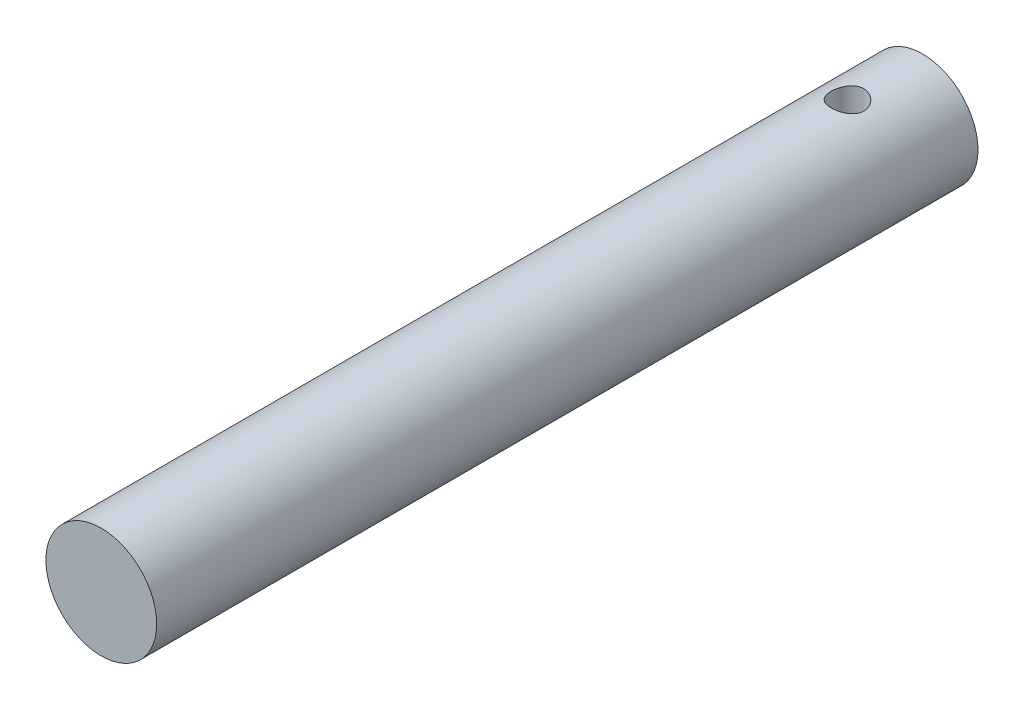
ISO-10303-21;
HEADER;
FILE_DESCRIPTION(('STEP AP214'),'2;1');
FILE_NAME('part.step','',(''),(''),'','','');
FILE_SCHEMA(('AUTOMOTIVE_DESIGN { 1 0 10303 214 1 1 1 1 }'));
ENDSEC;
DATA;
#1=APPLICATION_CONTEXT('core data for automotive mechanical design processes');
#2=APPLICATION_PROTOCOL_DEFINITION('international standard','automotive_design',2000,#1);
#3=PRODUCT_CONTEXT('',#1,'mechanical');
#4=PRODUCT('Part','Part','',(#3));
#5=PRODUCT_RELATED_PRODUCT_CATEGORY('part','',(#4));
#6=PRODUCT_DEFINITION_FORMATION('','',#4);
#7=PRODUCT_DEFINITION_CONTEXT('part definition',#1,'design');
#8=PRODUCT_DEFINITION('design','',#6,#7);
#9=PRODUCT_DEFINITION_SHAPE('','',#8);
#10=(LENGTH_UNIT() NAMED_UNIT(*) SI_UNIT(.MILLI.,.METRE.));
#11=(NAMED_UNIT(*) PLANE_ANGLE_UNIT() SI_UNIT($,.RADIAN.));
#12=(NAMED_UNIT(*) SI_UNIT($,.STERADIAN.) SOLID_ANGLE_UNIT());
#13=UNCERTAINTY_MEASURE_WITH_UNIT(LENGTH_MEASURE(1.E-05),#10,'distance_accuracy_value','');
#14=(GEOMETRIC_REPRESENTATION_CONTEXT(3) GLOBAL_UNCERTAINTY_ASSIGNED_CONTEXT((#13)) GLOBAL_UNIT_ASSIGNED_CONTEXT((#10,
#11,#12)) REPRESENTATION_CONTEXT('',''));
#15=CARTESIAN_POINT('',(0.,0.,0.));
#16=DIRECTION('',(0.,0.,1.));
#17=DIRECTION('',(1.,0.,0.));
#18=AXIS2_PLACEMENT_3D('',#15,#16,#17);
#19=CARTESIAN_POINT('',(0.,0.,89.));
#20=DIRECTION('',(0.,0.,-1.));
#21=DIRECTION('',(-1.,0.,0.));
#22=AXIS2_PLACEMENT_3D('',#19,#20,#21);
#23=CYLINDRICAL_SURFACE('',#22,6.);
#24=CARTESIAN_POINT('',(0.,-6.,6.45193384495039));
#25=CARTESIAN_POINT('',(-0.0981589939703736,-5.99999912553035,6.45722712161039));
#26=CARTESIAN_POINT('',(-0.195893627355128,-5.99756827380598,6.47064279163591));
#27=CARTESIAN_POINT('',(-0.387645070059898,-5.98823510352722,6.51327716783869));
#28=CARTESIAN_POINT('',(-0.481660563095357,-5.98133121662876,6.54250141625607));
#29=CARTESIAN_POINT('',(-0.663203684655316,-5.96393085040532,6.61573788714498));
#30=CARTESIAN_POINT('',(-0.750740805172326,-5.95343975904429,6.65972792965871));
#31=CARTESIAN_POINT('',(-0.917247696642102,-5.9300704277999,6.76120169999923));
#32=CARTESIAN_POINT('',(-0.996216452235155,-5.91719190549231,6.81868702448234));
#33=CARTESIAN_POINT('',(-1.14553470171172,-5.89013234401508,6.94723098003324));
#34=CARTESIAN_POINT('',(-1.21561658435395,-5.87592664644819,7.01859537111143));
#35=CARTESIAN_POINT('',(-1.34298115793278,-5.84813312807984,7.17207420919818));
#36=CARTESIAN_POINT('',(-1.40026234325196,-5.83454538011113,7.25418991897684));
#37=CARTESIAN_POINT('',(-1.50126472754359,-5.80938615993411,7.42850289257588));
#38=CARTESIAN_POINT('',(-1.54475046655802,-5.79785103773004,7.52084229045526));
#39=CARTESIAN_POINT('',(-1.61546455344666,-5.77854913877898,7.711917861516));
#40=CARTESIAN_POINT('',(-1.64269697374356,-5.77078141816537,7.81065242544928));
#41=CARTESIAN_POINT('',(-1.67938521528112,-5.76021030098019,8.00863458745727));
#42=CARTESIAN_POINT('',(-1.68933792088375,-5.7572682829843,8.10778262100481));
#43=CARTESIAN_POINT('',(-1.69263877787352,-5.75629908809258,8.30636973849283));
#44=CARTESIAN_POINT('',(-1.68598962839867,-5.75827111226918,8.4058087724969));
#45=CARTESIAN_POINT('',(-1.65674576935804,-5.76675039420702,8.59933500173528));
#46=CARTESIAN_POINT('',(-1.63458725625977,-5.77313352986367,8.69349420441194));
#47=CARTESIAN_POINT('',(-1.57553278408771,-5.78952746748481,8.87673338119604));
#48=CARTESIAN_POINT('',(-1.53863494635351,-5.79953873187205,8.96581270617245));
#49=CARTESIAN_POINT('',(-1.45031977193343,-5.82225760719022,9.13835462798297));
#50=CARTESIAN_POINT('',(-1.3986273855492,-5.83501503824765,9.22166966729843));
#51=CARTESIAN_POINT('',(-1.28244785155786,-5.86164412456185,9.37865121784254));
#52=CARTESIAN_POINT('',(-1.2179578960557,-5.87551602394419,9.45231560573743));
#53=CARTESIAN_POINT('',(-1.07535094677777,-5.90330989039028,9.59054686675218));
#54=CARTESIAN_POINT('',(-0.996839747755389,-5.91721699139799,9.65471091019525));
#55=CARTESIAN_POINT('',(-0.829867403982079,-5.94293229029509,9.76899176152758));
#56=CARTESIAN_POINT('',(-0.741406595045708,-5.95474055898859,9.81910904331731));
#57=CARTESIAN_POINT('',(-0.5574214882735,-5.97476261442765,9.9035210337451));
#58=CARTESIAN_POINT('',(-0.461937908586405,-5.98299546522705,9.93789971483817));
#59=CARTESIAN_POINT('',(-0.266271069037455,-5.99488880932818,9.99004501251307));
#60=CARTESIAN_POINT('',(-0.166089105699514,-5.9985505564171,10.0078161839567));
#61=CARTESIAN_POINT('',(0.0322232136226922,-6.00070329351695,10.0257900675117));
#62=CARTESIAN_POINT('',(0.130296420844028,-5.99937679321417,10.0266058905755));
#63=CARTESIAN_POINT('',(0.32507403749667,-5.99198000015561,10.012241326523));
#64=CARTESIAN_POINT('',(0.42177852805242,-5.98590998975868,9.99706189151052));
#65=CARTESIAN_POINT('',(0.610037073087875,-5.96964760663314,9.95153187974019));
#66=CARTESIAN_POINT('',(0.701635866449269,-5.95950101284544,9.92134892373637));
#67=CARTESIAN_POINT('',(0.87846248046005,-5.93601449587542,9.8468749606263));
#68=CARTESIAN_POINT('',(0.963689219511545,-5.92267403217051,9.80258156508447));
#69=CARTESIAN_POINT('',(1.12834118951306,-5.89356124457394,9.69950258337219));
#70=CARTESIAN_POINT('',(1.20749205233336,-5.87772455924555,9.64029710641231));
#71=CARTESIAN_POINT('',(1.35493620291722,-5.84549860857085,9.50973941950028));
#72=CARTESIAN_POINT('',(1.42322675789763,-5.82910920539746,9.43838416161805));
#73=CARTESIAN_POINT('',(1.54924306596897,-5.79691452951496,9.28279336678507));
#74=CARTESIAN_POINT('',(1.60655956822582,-5.78114486821064,9.19821803496963));
#75=CARTESIAN_POINT('',(1.70612387367865,-5.75255048129158,9.02015792240114));
#76=CARTESIAN_POINT('',(1.74837382699027,-5.73972533556432,8.92667441532998));
#77=CARTESIAN_POINT('',(1.81576927475437,-5.71875990457277,8.73511021542849));
#78=CARTESIAN_POINT('',(1.84120601752018,-5.71054024476593,8.6371410609498));
#79=CARTESIAN_POINT('',(1.87519024204499,-5.69947285053376,8.43803154192809));
#80=CARTESIAN_POINT('',(1.88374365993022,-5.69662322803542,8.33689230468704));
#81=CARTESIAN_POINT('',(1.88363204774477,-5.6966590407518,8.13923846393843));
#82=CARTESIAN_POINT('',(1.87573135058275,-5.69928989616014,8.04272243425636));
#83=CARTESIAN_POINT('',(1.8445414125327,-5.70945984282266,7.85248422977896));
#84=CARTESIAN_POINT('',(1.82125189075,-5.71699902366925,7.75876210601387));
#85=CARTESIAN_POINT('',(1.76017944291828,-5.73609443024919,7.5769140780013));
#86=CARTESIAN_POINT('',(1.72243659138085,-5.74763954056847,7.48877347849598));
#87=CARTESIAN_POINT('',(1.63359457900836,-5.77351729303228,7.31995050722088));
#88=CARTESIAN_POINT('',(1.58249243858195,-5.78785055685037,7.23926980471155));
#89=CARTESIAN_POINT('',(1.46576307313484,-5.81853321402401,7.08387831611617));
#90=CARTESIAN_POINT('',(1.39959813606673,-5.83494338224661,7.00958320954853));
#91=CARTESIAN_POINT('',(1.2558438007286,-5.86756182461082,6.87293295390057));
#92=CARTESIAN_POINT('',(1.17825155376794,-5.88377004731394,6.8105807909946));
#93=CARTESIAN_POINT('',(1.0113989499108,-5.91476523830952,6.69801742782261));
#94=CARTESIAN_POINT('',(0.921887993527252,-5.92950439178107,6.64816340012943));
#95=CARTESIAN_POINT('',(0.73526619394301,-5.95552148233233,6.56435157611458));
#96=CARTESIAN_POINT('',(0.638159469233721,-5.96680127900106,6.53038523413781));
#97=CARTESIAN_POINT('',(0.451136692492847,-5.98366208943459,6.48260104446463));
#98=CARTESIAN_POINT('',(0.361756675730947,-5.98976463555431,6.46685406177117));
#99=CARTESIAN_POINT('',(0.18146391217883,-5.9979337004167,6.44907994441642));
#100=CARTESIAN_POINT('',(0.0905513904566932,-6.00000080669575,6.44705081241055));
#101=CARTESIAN_POINT('',(0.,-6.,6.45193384495039));
#102=B_SPLINE_CURVE_WITH_KNOTS('',3,(#24,#25,#26,#27,#28,#29,#30,#31,#32,#33,#34,#35,#36,#37,
#38,#39,#40,#41,#42,#43,#44,#45,#46,#47,#48,#49,#50,#51,#52,#53,#54,#55,#56,#57,#58,#59,#60,#61,
#62,#63,#64,#65,#66,#67,#68,#69,#70,#71,#72,#73,#74,#75,#76,#77,#78,#79,#80,#81,#82,#83,#84,#85,
#86,#87,#88,#89,#90,#91,#92,#93,#94,#95,#96,#97,#98,#99,#100,#101),.UNSPECIFIED.,.T.,.F.,(4,2,2,
2,2,2,2,2,2,2,2,2,2,2,2,2,2,2,2,2,2,2,2,2,2,2,2,2,2,2,2,2,2,2,2,2,2,2,4),(0.,0.29457037867354,
0.589244096104816,0.883477145196146,1.17774502320245,1.47943446575808,1.78115937435672,
2.08778700685607,2.39433777861393,2.69191781313658,2.98944947009694,3.27893282515959,
3.5684530892766,3.86375086097786,4.1591134952903,4.46469292186468,4.77026203775913,
5.07418124079912,5.37801706489725,5.67084617977806,5.96365786524615,6.25326936896729,
6.54292992050753,6.84189682809621,7.14093884620666,7.44957518017546,7.75816745165675,
8.06126331058274,8.36425258292072,8.65348162124199,8.94271593905261,9.23115404111098,
9.51965652997898,9.82078250321976,10.1219836710014,10.4310034866538,10.7398568953056,
11.0116367974331,11.2833771270487),.UNSPECIFIED.);
#103=CARTESIAN_POINT('',(0.,-6.,6.45193384495039));
#104=VERTEX_POINT('',#103);
#105=EDGE_CURVE('E55',#104,#104,#102,.T.);
#106=ORIENTED_EDGE('',*,*,#105,.T.);
#107=EDGE_LOOP('',(#106));
#108=FACE_BOUND('',#107,.T.);
#109=CARTESIAN_POINT('',(0.,0.,89.));
#110=DIRECTION('',(0.,0.,1.));
#111=DIRECTION('',(1.,0.,0.));
#112=AXIS2_PLACEMENT_3D('',#109,#110,#111);
#113=CIRCLE('',#112,6.);
#114=CARTESIAN_POINT('',(6.,0.,89.));
#115=VERTEX_POINT('',#114);
#116=EDGE_CURVE('E60',#115,#115,#113,.T.);
#117=ORIENTED_EDGE('',*,*,#116,.F.);
#118=EDGE_LOOP('',(#117));
#119=FACE_BOUND('',#118,.T.);
#120=CARTESIAN_POINT('',(0.,0.,0.));
#121=DIRECTION('',(0.,0.,1.));
#122=DIRECTION('',(1.,0.,0.));
#123=AXIS2_PLACEMENT_3D('',#120,#121,#122);
#124=CIRCLE('',#123,6.);
#125=CARTESIAN_POINT('',(6.,0.,0.));
#126=VERTEX_POINT('',#125);
#127=EDGE_CURVE('E65',#126,#126,#124,.T.);
#128=ORIENTED_EDGE('',*,*,#127,.T.);
#129=EDGE_LOOP('',(#128));
#130=FACE_BOUND('',#129,.T.);
#131=CARTESIAN_POINT('',(0.,6.,6.45193384495039));
#132=CARTESIAN_POINT('',(-0.0981589939703736,5.99999912553035,6.45722712161039));
#133=CARTESIAN_POINT('',(-0.195893627355128,5.99756827380598,6.47064279163591));
#134=CARTESIAN_POINT('',(-0.387645070059898,5.98823510352722,6.51327716783869));
#135=CARTESIAN_POINT('',(-0.481660563095357,5.98133121662876,6.54250141625607));
#136=CARTESIAN_POINT('',(-0.663203684655316,5.96393085040532,6.61573788714498));
#137=CARTESIAN_POINT('',(-0.750740805172326,5.95343975904429,6.65972792965871));
#138=CARTESIAN_POINT('',(-0.917247696642102,5.9300704277999,6.76120169999923));
#139=CARTESIAN_POINT('',(-0.996216452235155,5.91719190549231,6.81868702448234));
#140=CARTESIAN_POINT('',(-1.14553470171172,5.89013234401508,6.94723098003324));
#141=CARTESIAN_POINT('',(-1.21561658435395,5.87592664644819,7.01859537111143));
#142=CARTESIAN_POINT('',(-1.34298115793278,5.84813312807984,7.17207420919818));
#143=CARTESIAN_POINT('',(-1.40026234325196,5.83454538011113,7.25418991897684));
#144=CARTESIAN_POINT('',(-1.50126472754359,5.80938615993411,7.42850289257588));
#145=CARTESIAN_POINT('',(-1.54475046655802,5.79785103773004,7.52084229045526));
#146=CARTESIAN_POINT('',(-1.61546455344666,5.77854913877898,7.711917861516));
#147=CARTESIAN_POINT('',(-1.64269697374356,5.77078141816537,7.81065242544928));
#148=CARTESIAN_POINT('',(-1.67938521528112,5.76021030098019,8.00863458745727));
#149=CARTESIAN_POINT('',(-1.68933792088375,5.7572682829843,8.10778262100481));
#150=CARTESIAN_POINT('',(-1.69263877787352,5.75629908809258,8.30636973849283));
#151=CARTESIAN_POINT('',(-1.68598962839867,5.75827111226918,8.4058087724969));
#152=CARTESIAN_POINT('',(-1.65674576935804,5.76675039420702,8.59933500173528));
#153=CARTESIAN_POINT('',(-1.63458725625977,5.77313352986367,8.69349420441194));
#154=CARTESIAN_POINT('',(-1.57553278408771,5.78952746748481,8.87673338119604));
#155=CARTESIAN_POINT('',(-1.53863494635351,5.79953873187205,8.96581270617245));
#156=CARTESIAN_POINT('',(-1.45031977193343,5.82225760719022,9.13835462798297));
#157=CARTESIAN_POINT('',(-1.3986273855492,5.83501503824765,9.22166966729843));
#158=CARTESIAN_POINT('',(-1.28244785155786,5.86164412456185,9.37865121784254));
#159=CARTESIAN_POINT('',(-1.2179578960557,5.87551602394419,9.45231560573743));
#160=CARTESIAN_POINT('',(-1.07535094677777,5.90330989039028,9.59054686675218));
#161=CARTESIAN_POINT('',(-0.996839747755389,5.91721699139799,9.65471091019525));
#162=CARTESIAN_POINT('',(-0.829867403982079,5.94293229029509,9.76899176152758));
#163=CARTESIAN_POINT('',(-0.741406595045708,5.95474055898859,9.81910904331731));
#164=CARTESIAN_POINT('',(-0.5574214882735,5.97476261442765,9.9035210337451));
#165=CARTESIAN_POINT('',(-0.461937908586405,5.98299546522705,9.93789971483817));
#166=CARTESIAN_POINT('',(-0.266271069037455,5.99488880932818,9.99004501251307));
#167=CARTESIAN_POINT('',(-0.166089105699514,5.9985505564171,10.0078161839567));
#168=CARTESIAN_POINT('',(0.0322232136226922,6.00070329351695,10.0257900675117));
#169=CARTESIAN_POINT('',(0.130296420844028,5.99937679321417,10.0266058905755));
#170=CARTESIAN_POINT('',(0.32507403749667,5.99198000015561,10.012241326523));
#171=CARTESIAN_POINT('',(0.42177852805242,5.98590998975868,9.99706189151052));
#172=CARTESIAN_POINT('',(0.610037073087875,5.96964760663314,9.95153187974019));
#173=CARTESIAN_POINT('',(0.701635866449269,5.95950101284544,9.92134892373637));
#174=CARTESIAN_POINT('',(0.87846248046005,5.93601449587542,9.8468749606263));
#175=CARTESIAN_POINT('',(0.963689219511545,5.92267403217051,9.80258156508447));
#176=CARTESIAN_POINT('',(1.12834118951306,5.89356124457394,9.69950258337219));
#177=CARTESIAN_POINT('',(1.20749205233336,5.87772455924555,9.64029710641231));
#178=CARTESIAN_POINT('',(1.35493620291722,5.84549860857085,9.50973941950028));
#179=CARTESIAN_POINT('',(1.42322675789763,5.82910920539746,9.43838416161805));
#180=CARTESIAN_POINT('',(1.54924306596897,5.79691452951496,9.28279336678507));
#181=CARTESIAN_POINT('',(1.60655956822582,5.78114486821064,9.19821803496963));
#182=CARTESIAN_POINT('',(1.70612387367865,5.75255048129158,9.02015792240114));
#183=CARTESIAN_POINT('',(1.74837382699027,5.73972533556432,8.92667441532998));
#184=CARTESIAN_POINT('',(1.81576927475437,5.71875990457277,8.73511021542849));
#185=CARTESIAN_POINT('',(1.84120601752018,5.71054024476593,8.6371410609498));
#186=CARTESIAN_POINT('',(1.87519024204499,5.69947285053376,8.43803154192809));
#187=CARTESIAN_POINT('',(1.88374365993022,5.69662322803542,8.33689230468704));
#188=CARTESIAN_POINT('',(1.88363204774477,5.6966590407518,8.13923846393843));
#189=CARTESIAN_POINT('',(1.87573135058275,5.69928989616014,8.04272243425636));
#190=CARTESIAN_POINT('',(1.8445414125327,5.70945984282266,7.85248422977896));
#191=CARTESIAN_POINT('',(1.82125189075,5.71699902366925,7.75876210601387));
#192=CARTESIAN_POINT('',(1.76017944291828,5.73609443024919,7.5769140780013));
#193=CARTESIAN_POINT('',(1.72243659138085,5.74763954056847,7.48877347849598));
#194=CARTESIAN_POINT('',(1.63359457900836,5.77351729303228,7.31995050722088));
#195=CARTESIAN_POINT('',(1.58249243858195,5.78785055685037,7.23926980471155));
#196=CARTESIAN_POINT('',(1.46576307313484,5.81853321402401,7.08387831611617));
#197=CARTESIAN_POINT('',(1.39959813606673,5.83494338224661,7.00958320954853));
#198=CARTESIAN_POINT('',(1.2558438007286,5.86756182461082,6.87293295390057));
#199=CARTESIAN_POINT('',(1.17825155376794,5.88377004731394,6.8105807909946));
#200=CARTESIAN_POINT('',(1.0113989499108,5.91476523830952,6.69801742782261));
#201=CARTESIAN_POINT('',(0.921887993527252,5.92950439178107,6.64816340012943));
#202=CARTESIAN_POINT('',(0.73526619394301,5.95552148233233,6.56435157611458));
#203=CARTESIAN_POINT('',(0.638159469233721,5.96680127900106,6.53038523413781));
#204=CARTESIAN_POINT('',(0.451136692492847,5.98366208943459,6.48260104446463));
#205=CARTESIAN_POINT('',(0.361756675730947,5.98976463555431,6.46685406177117));
#206=CARTESIAN_POINT('',(0.18146391217883,5.9979337004167,6.44907994441642));
#207=CARTESIAN_POINT('',(0.0905513904566932,6.00000080669575,6.44705081241055));
#208=CARTESIAN_POINT('',(0.,6.,6.45193384495039));
#209=B_SPLINE_CURVE_WITH_KNOTS('',3,(#131,#132,#133,#134,#135,#136,#137,#138,#139,#140,#141,
#142,#143,#144,#145,#146,#147,#148,#149,#150,#151,#152,#153,#154,#155,#156,#157,#158,#159,#160,
#161,#162,#163,#164,#165,#166,#167,#168,#169,#170,#171,#172,#173,#174,#175,#176,#177,#178,#179,
#180,#181,#182,#183,#184,#185,#186,#187,#188,#189,#190,#191,#192,#193,#194,#195,#196,#197,#198,
#199,#200,#201,#202,#203,#204,#205,#206,#207,#208),.UNSPECIFIED.,.T.,.F.,(4,2,2,2,2,2,2,2,2,2,2,
2,2,2,2,2,2,2,2,2,2,2,2,2,2,2,2,2,2,2,2,2,2,2,2,2,2,2,4),(0.,0.29457037867354,0.589244096104816,
0.883477145196146,1.17774502320245,1.47943446575808,1.78115937435672,2.08778700685607,
2.39433777861393,2.69191781313658,2.98944947009694,3.27893282515959,3.5684530892766,
3.86375086097786,4.1591134952903,4.46469292186468,4.77026203775913,5.07418124079912,
5.37801706489725,5.67084617977806,5.96365786524615,6.25326936896729,6.54292992050753,
6.84189682809621,7.14093884620666,7.44957518017546,7.75816745165675,8.06126331058274,
8.36425258292072,8.65348162124199,8.94271593905261,9.23115404111098,9.51965652997898,
9.82078250321976,10.1219836710014,10.4310034866538,10.7398568953056,11.0116367974331,
11.2833771270487),.UNSPECIFIED.);
#210=CARTESIAN_POINT('',(0.,6.,6.45193384495039));
#211=VERTEX_POINT('',#210);
#212=EDGE_CURVE('E10',#211,#211,#209,.T.);
#213=ORIENTED_EDGE('',*,*,#212,.F.);
#214=EDGE_LOOP('',(#213));
#215=FACE_BOUND('',#214,.T.);
#216=ADVANCED_FACE('F43',(#108,#119,#130,#215),#23,.T.);
#217=CARTESIAN_POINT('',(0.,0.,89.));
#218=DIRECTION('',(0.,0.,1.));
#219=DIRECTION('',(1.,0.,0.));
#220=AXIS2_PLACEMENT_3D('',#217,#218,#219);
#221=PLANE('',#220);
#222=ORIENTED_EDGE('',*,*,#116,.T.);
#223=EDGE_LOOP('',(#222));
#224=FACE_BOUND('',#223,.T.);
#225=ADVANCED_FACE('F79',(#224),#221,.T.);
#226=CARTESIAN_POINT('',(0.,0.,0.));
#227=DIRECTION('',(0.,0.,1.));
#228=DIRECTION('',(1.,0.,0.));
#229=AXIS2_PLACEMENT_3D('',#226,#227,#228);
#230=PLANE('',#229);
#231=ORIENTED_EDGE('',*,*,#127,.F.);
#232=EDGE_LOOP('',(#231));
#233=FACE_BOUND('',#232,.T.);
#234=ADVANCED_FACE('F76',(#233),#230,.F.);
#235=CARTESIAN_POINT('',(0.0962256494073445,-6.,8.23680308112848));
#236=DIRECTION('',(0.,1.,0.));
#237=DIRECTION('',(0.,0.,1.));
#238=AXIS2_PLACEMENT_3D('',#235,#236,#237);
#239=CYLINDRICAL_SURFACE('',#238,1.78746120681228);
#240=ORIENTED_EDGE('',*,*,#105,.F.);
#241=EDGE_LOOP('',(#240));
#242=FACE_BOUND('',#241,.T.);
#243=ORIENTED_EDGE('',*,*,#212,.T.);
#244=EDGE_LOOP('',(#243));
#245=FACE_BOUND('',#244,.T.);
#246=ADVANCED_FACE('F72',(#242,#245),#239,.F.);
#247=CLOSED_SHELL('',(#216,#225,#234,#246));
#248=MANIFOLD_SOLID_BREP('B2',#247);
#249=ADVANCED_BREP_SHAPE_REPRESENTATION('',(#18,#248),#14);
#250=SHAPE_DEFINITION_REPRESENTATION(#9,#249);
ENDSEC;
END-ISO-10303-21;
